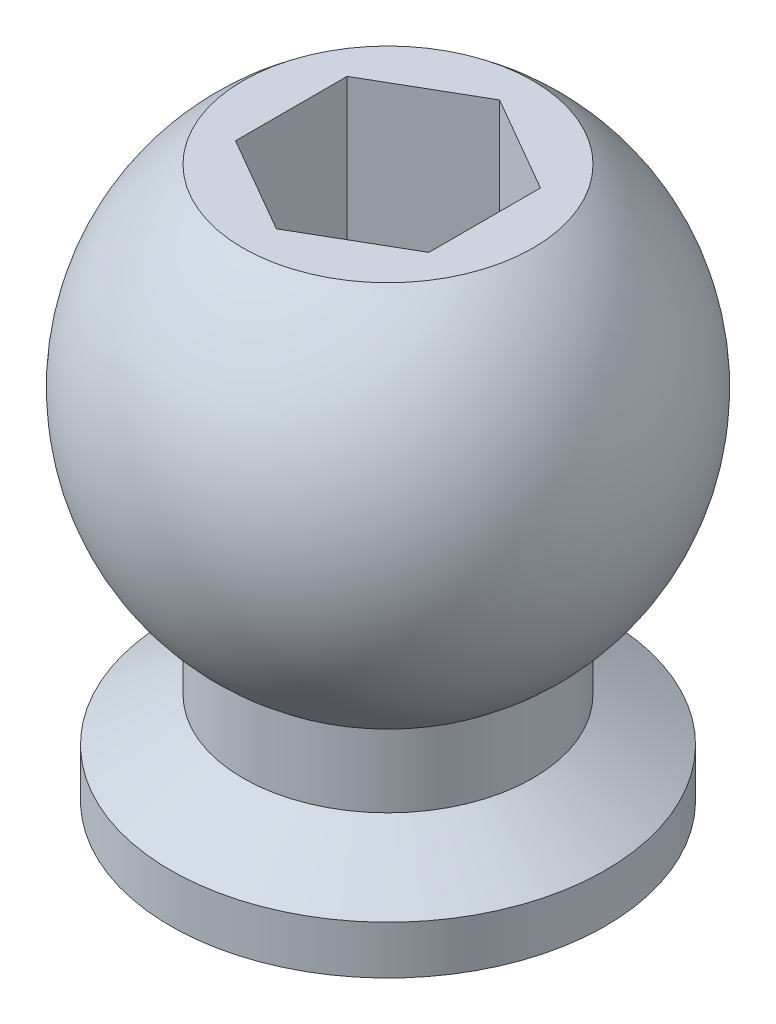
ISO-10303-21;
HEADER;
FILE_DESCRIPTION(('STEP AP214'),'2;1');
FILE_NAME('part.step','',(''),(''),'','','');
FILE_SCHEMA(('AUTOMOTIVE_DESIGN { 1 0 10303 214 1 1 1 1 }'));
ENDSEC;
DATA;
#1=APPLICATION_CONTEXT('core data for automotive mechanical design processes');
#2=APPLICATION_PROTOCOL_DEFINITION('international standard','automotive_design',2000,#1);
#3=PRODUCT_CONTEXT('',#1,'mechanical');
#4=PRODUCT('Part','Part','',(#3));
#5=PRODUCT_RELATED_PRODUCT_CATEGORY('part','',(#4));
#6=PRODUCT_DEFINITION_FORMATION('','',#4);
#7=PRODUCT_DEFINITION_CONTEXT('part definition',#1,'design');
#8=PRODUCT_DEFINITION('design','',#6,#7);
#9=PRODUCT_DEFINITION_SHAPE('','',#8);
#10=(LENGTH_UNIT() NAMED_UNIT(*) SI_UNIT(.MILLI.,.METRE.));
#11=(NAMED_UNIT(*) PLANE_ANGLE_UNIT() SI_UNIT($,.RADIAN.));
#12=(NAMED_UNIT(*) SI_UNIT($,.STERADIAN.) SOLID_ANGLE_UNIT());
#13=UNCERTAINTY_MEASURE_WITH_UNIT(LENGTH_MEASURE(1.E-05),#10,'distance_accuracy_value','');
#14=(GEOMETRIC_REPRESENTATION_CONTEXT(3) GLOBAL_UNCERTAINTY_ASSIGNED_CONTEXT((#13)) GLOBAL_UNIT_ASSIGNED_CONTEXT((#10,
#11,#12)) REPRESENTATION_CONTEXT('',''));
#15=CARTESIAN_POINT('',(0.,0.,0.));
#16=DIRECTION('',(0.,0.,1.));
#17=DIRECTION('',(1.,0.,0.));
#18=AXIS2_PLACEMENT_3D('',#15,#16,#17);
#19=CARTESIAN_POINT('',(0.,0.,0.));
#20=DIRECTION('',(0.,1.,0.));
#21=DIRECTION('',(0.,0.,1.));
#22=AXIS2_PLACEMENT_3D('',#19,#20,#21);
#23=PLANE('',#22);
#24=CARTESIAN_POINT('',(0.,0.,0.));
#25=DIRECTION('',(0.,-1.,0.));
#26=DIRECTION('',(0.,0.,-1.));
#27=AXIS2_PLACEMENT_3D('',#24,#25,#26);
#28=CIRCLE('',#27,0.8);
#29=CARTESIAN_POINT('',(0.,0.,-0.8));
#30=VERTEX_POINT('',#29);
#31=EDGE_CURVE('E213',#30,#30,#28,.T.);
#32=ORIENTED_EDGE('',*,*,#31,.F.);
#33=EDGE_LOOP('',(#32));
#34=FACE_BOUND('',#33,.T.);
#35=CARTESIAN_POINT('',(0.,0.,0.));
#36=DIRECTION('',(0.,-1.,0.));
#37=DIRECTION('',(0.,0.,-1.));
#38=AXIS2_PLACEMENT_3D('',#35,#36,#37);
#39=CIRCLE('',#38,2.25);
#40=CARTESIAN_POINT('',(0.,0.,-2.25));
#41=VERTEX_POINT('',#40);
#42=EDGE_CURVE('E139',#41,#41,#39,.T.);
#43=ORIENTED_EDGE('',*,*,#42,.T.);
#44=EDGE_LOOP('',(#43));
#45=FACE_BOUND('',#44,.T.);
#46=ADVANCED_FACE('F37',(#34,#45),#23,.F.);
#47=CARTESIAN_POINT('',(0.,5.7,0.));
#48=DIRECTION('',(0.,-1.,0.));
#49=DIRECTION('',(0.,0.,-1.));
#50=AXIS2_PLACEMENT_3D('',#47,#48,#49);
#51=PLANE('',#50);
#52=DIRECTION('',(0.86602540378443,0.,-0.500000000000015));
#53=VECTOR('',#52,1.);
#54=CARTESIAN_POINT('',(0.999999999999991,5.7,0.577350269189625));
#55=LINE('',#54,#53);
#56=CARTESIAN_POINT('',(0.,5.7,1.15470053837927));
#57=VERTEX_POINT('',#56);
#58=CARTESIAN_POINT('',(0.999999999999991,5.7,0.577350269189625));
#59=VERTEX_POINT('',#58);
#60=EDGE_CURVE('E126',#57,#59,#55,.T.);
#61=ORIENTED_EDGE('',*,*,#60,.F.);
#62=DIRECTION('',(0.86602540378443,0.,0.500000000000015));
#63=VECTOR('',#62,1.);
#64=CARTESIAN_POINT('',(0.,5.7,1.15470053837927));
#65=LINE('',#64,#63);
#66=CARTESIAN_POINT('',(-0.999999999999978,5.7,0.577350269189625));
#67=VERTEX_POINT('',#66);
#68=EDGE_CURVE('E52',#67,#57,#65,.T.);
#69=ORIENTED_EDGE('',*,*,#68,.F.);
#70=DIRECTION('',(0.,0.,1.));
#71=VECTOR('',#70,1.);
#72=CARTESIAN_POINT('',(-0.999999999999978,5.7,0.577350269189625));
#73=LINE('',#72,#71);
#74=CARTESIAN_POINT('',(-0.999999999999978,5.7,-0.577350269189621));
#75=VERTEX_POINT('',#74);
#76=EDGE_CURVE('E135',#75,#67,#73,.T.);
#77=ORIENTED_EDGE('',*,*,#76,.F.);
#78=DIRECTION('',(-0.86602540378443,0.,0.500000000000015));
#79=VECTOR('',#78,1.);
#80=CARTESIAN_POINT('',(-0.999999999999978,5.7,-0.577350269189621));
#81=LINE('',#80,#79);
#82=CARTESIAN_POINT('',(0.,5.7,-1.15470053837926));
#83=VERTEX_POINT('',#82);
#84=EDGE_CURVE('E133',#83,#75,#81,.T.);
#85=ORIENTED_EDGE('',*,*,#84,.F.);
#86=DIRECTION('',(-0.86602540378443,0.,-0.500000000000015));
#87=VECTOR('',#86,1.);
#88=CARTESIAN_POINT('',(0.,5.7,-1.15470053837926));
#89=LINE('',#88,#87);
#90=CARTESIAN_POINT('',(0.999999999999991,5.7,-0.577350269189621));
#91=VERTEX_POINT('',#90);
#92=EDGE_CURVE('E100',#91,#83,#89,.T.);
#93=ORIENTED_EDGE('',*,*,#92,.F.);
#94=DIRECTION('',(0.,0.,-1.));
#95=VECTOR('',#94,1.);
#96=CARTESIAN_POINT('',(0.999999999999991,5.7,-0.577350269189621));
#97=LINE('',#96,#95);
#98=EDGE_CURVE('E129',#59,#91,#97,.T.);
#99=ORIENTED_EDGE('',*,*,#98,.F.);
#100=EDGE_LOOP('',(#61,#69,#77,#85,#93,#99));
#101=FACE_BOUND('',#100,.T.);
#102=CARTESIAN_POINT('',(0.,5.7,0.));
#103=DIRECTION('',(0.,-1.,0.));
#104=DIRECTION('',(0.,0.,-1.));
#105=AXIS2_PLACEMENT_3D('',#102,#103,#104);
#106=CIRCLE('',#105,1.5);
#107=CARTESIAN_POINT('',(-1.5,5.7,0.));
#108=VERTEX_POINT('',#107);
#109=EDGE_CURVE('E11',#108,#108,#106,.T.);
#110=ORIENTED_EDGE('',*,*,#109,.F.);
#111=EDGE_LOOP('',(#110));
#112=FACE_BOUND('',#111,.T.);
#113=ADVANCED_FACE('F161',(#101,#112),#51,.F.);
#114=CARTESIAN_POINT('',(0.,3.7,0.));
#115=DIRECTION('',(0.,-1.,0.));
#116=DIRECTION('',(-1.,0.,0.));
#117=AXIS2_PLACEMENT_3D('',#114,#115,#116);
#118=SPHERICAL_SURFACE('',#117,2.5);
#119=CARTESIAN_POINT('',(0.,1.7,0.));
#120=DIRECTION('',(0.,-1.,0.));
#121=DIRECTION('',(0.,0.,-1.));
#122=AXIS2_PLACEMENT_3D('',#119,#120,#121);
#123=CIRCLE('',#122,1.5);
#124=CARTESIAN_POINT('',(-1.5,1.7,0.));
#125=VERTEX_POINT('',#124);
#126=EDGE_CURVE('E45',#125,#125,#123,.T.);
#127=CARTESIAN_POINT('',(-1.5,1.7,0.));
#128=CARTESIAN_POINT('',(-1.5386383877575,1.72897668414672,0.));
#129=CARTESIAN_POINT('',(-1.5764349304277,1.75907554612936,0.));
#130=CARTESIAN_POINT('',(-1.65022218904126,1.8214108940858,0.));
#131=CARTESIAN_POINT('',(-1.68621290498462,1.85364738005959,0.));
#132=CARTESIAN_POINT('',(-1.75626637359227,1.92015124431761,0.));
#133=CARTESIAN_POINT('',(-1.79032912625656,1.95441862260183,0.));
#134=CARTESIAN_POINT('',(-1.85641263057405,2.0248687968109,0.));
#135=CARTESIAN_POINT('',(-1.88843338222726,2.06105159273575,0.));
#136=CARTESIAN_POINT('',(-1.95032526836538,2.13521121103541,0.));
#137=CARTESIAN_POINT('',(-1.98019640285029,2.17318803341023,0.));
#138=CARTESIAN_POINT('',(-2.03768877346254,2.25080815107381,0.));
#139=CARTESIAN_POINT('',(-2.06531000958988,2.29045144636258,0.));
#140=CARTESIAN_POINT('',(-2.11820982609088,2.37127139738285,0.));
#141=CARTESIAN_POINT('',(-2.14348840646454,2.41244805311435,0.));
#142=CARTESIAN_POINT('',(-2.19161802896365,2.49619645368338,0.));
#143=CARTESIAN_POINT('',(-2.21446907108911,2.53876819852091,0.));
#144=CARTESIAN_POINT('',(-2.25766688391047,2.6251638239793,0.));
#145=CARTESIAN_POINT('',(-2.27801365460637,2.66898770460017,0.));
#146=CARTESIAN_POINT('',(-2.31613460121235,2.75774044297864,0.));
#147=CARTESIAN_POINT('',(-2.33390877712243,2.80266930073624,0.));
#148=CARTESIAN_POINT('',(-2.36682484928968,2.8934811244719,0.));
#149=CARTESIAN_POINT('',(-2.38196674554685,2.93936409044996,0.));
#150=CARTESIAN_POINT('',(-2.40956741265362,3.03193005780935,0.));
#151=CARTESIAN_POINT('',(-2.42202618350321,3.07861305919069,0.));
#152=CARTESIAN_POINT('',(-2.44421876383544,3.17262233807251,0.));
#153=CARTESIAN_POINT('',(-2.45395257331807,3.219948615573,0.));
#154=CARTESIAN_POINT('',(-2.47066254525011,3.31508552731488,0.));
#155=CARTESIAN_POINT('',(-2.47763870769951,3.36289616155627,0.));
#156=CARTESIAN_POINT('',(-2.48880995994487,3.4588412409559,0.));
#157=CARTESIAN_POINT('',(-2.49300504974084,3.50697568611415,0.));
#158=CARTESIAN_POINT('',(-2.49860006976841,3.60340675418159,0.));
#159=CARTESIAN_POINT('',(-2.5,3.6517033770908,0.));
#160=CARTESIAN_POINT('',(-2.5,3.74829662290921,0.));
#161=CARTESIAN_POINT('',(-2.49860006976841,3.79659324581841,0.));
#162=CARTESIAN_POINT('',(-2.49300504974084,3.89302431388586,0.));
#163=CARTESIAN_POINT('',(-2.48880995994487,3.9411587590441,0.));
#164=CARTESIAN_POINT('',(-2.47763870769951,4.03710383844373,0.));
#165=CARTESIAN_POINT('',(-2.47066254525011,4.08491447268513,0.));
#166=CARTESIAN_POINT('',(-2.45395257331807,4.180051384427,0.));
#167=CARTESIAN_POINT('',(-2.44421876383544,4.22737766192749,0.));
#168=CARTESIAN_POINT('',(-2.42202618350321,4.32138694080932,0.));
#169=CARTESIAN_POINT('',(-2.40956741265362,4.36806994219065,0.));
#170=CARTESIAN_POINT('',(-2.38196674554685,4.46063590955005,0.));
#171=CARTESIAN_POINT('',(-2.36682484928968,4.5065188755281,0.));
#172=CARTESIAN_POINT('',(-2.33390877712243,4.59733069926376,0.));
#173=CARTESIAN_POINT('',(-2.31613460121235,4.64225955702136,0.));
#174=CARTESIAN_POINT('',(-2.27801365460637,4.73101229539983,0.));
#175=CARTESIAN_POINT('',(-2.25766688391047,4.7748361760207,0.));
#176=CARTESIAN_POINT('',(-2.21446907108911,4.86123180147909,0.));
#177=CARTESIAN_POINT('',(-2.19161802896365,4.90380354631662,0.));
#178=CARTESIAN_POINT('',(-2.14348840646454,4.98755194688565,0.));
#179=CARTESIAN_POINT('',(-2.11820982609088,5.02872860261715,0.));
#180=CARTESIAN_POINT('',(-2.06531000958988,5.10954855363742,0.));
#181=CARTESIAN_POINT('',(-2.03768877346254,5.14919184892619,0.));
#182=CARTESIAN_POINT('',(-1.98019640285029,5.22681196658977,0.));
#183=CARTESIAN_POINT('',(-1.95032526836538,5.26478878896459,0.));
#184=CARTESIAN_POINT('',(-1.88843338222726,5.33894840726425,0.));
#185=CARTESIAN_POINT('',(-1.85641263057405,5.3751312031891,0.));
#186=CARTESIAN_POINT('',(-1.79032912625656,5.44558137739817,0.));
#187=CARTESIAN_POINT('',(-1.75626637359227,5.4798487556824,0.));
#188=CARTESIAN_POINT('',(-1.68621290498462,5.54635261994041,0.));
#189=CARTESIAN_POINT('',(-1.65022218904126,5.5785891059142,0.));
#190=CARTESIAN_POINT('',(-1.5764349304277,5.64092445387064,0.));
#191=CARTESIAN_POINT('',(-1.5386383877575,5.67102331585329,0.));
#192=CARTESIAN_POINT('',(-1.5,5.7,0.));
#193=B_SPLINE_CURVE_WITH_KNOTS('',3,(#127,#128,#129,#130,#131,#132,#133,#134,#135,#136,#137,
#138,#139,#140,#141,#142,#143,#144,#145,#146,#147,#148,#149,#150,#151,#152,#153,#154,#155,#156,
#157,#158,#159,#160,#161,#162,#163,#164,#165,#166,#167,#168,#169,#170,#171,#172,#173,#174,#175,
#176,#177,#178,#179,#180,#181,#182,#183,#184,#185,#186,#187,#188,#189,#190,#191,#192),
.UNSPECIFIED.,.F.,.F.,(4,2,2,2,2,2,2,2,2,2,2,2,2,2,2,2,2,2,2,2,2,2,2,2,2,2,2,2,2,2,2,2,4),(0.,
0.14486960076868,0.28973920153736,0.43460880230604,0.579478403074719,0.724348003843399,
0.869217604612079,1.01408720538076,1.15895680614944,1.30382640691812,1.4486960076868,
1.59356560845548,1.73843520922416,1.88330480999284,2.02817441076152,2.1730440115302,
2.31791361229888,2.46278321306756,2.60765281383624,2.75252241460492,2.89739201537359,
3.04226161614227,3.18713121691095,3.33200081767963,3.47687041844831,3.62174001921699,
3.76660961998567,3.91147922075435,4.05634882152303,4.20121842229171,4.34608802306039,
4.49095762382907,4.63582722459775),.UNSPECIFIED.);
#194=EDGE_CURVE('BSEAM158',#125,#108,#193,.T.);
#195=ORIENTED_EDGE('',*,*,#126,.F.);
#196=ORIENTED_EDGE('',*,*,#109,.T.);
#197=ORIENTED_EDGE('',*,*,#194,.T.);
#198=ORIENTED_EDGE('',*,*,#194,.F.);
#199=EDGE_LOOP('',(#195,#197,#196,#198));
#200=FACE_BOUND('',#199,.T.);
#201=ADVANCED_FACE('F158',(#200),#118,.T.);
#202=CARTESIAN_POINT('',(0.,0.,0.));
#203=DIRECTION('',(0.,-1.,0.));
#204=DIRECTION('',(0.,0.,-1.));
#205=AXIS2_PLACEMENT_3D('',#202,#203,#204);
#206=CYLINDRICAL_SURFACE('',#205,1.5);
#207=CARTESIAN_POINT('',(0.,0.95,0.));
#208=DIRECTION('',(0.,-1.,0.));
#209=DIRECTION('',(0.,0.,-1.));
#210=AXIS2_PLACEMENT_3D('',#207,#208,#209);
#211=CIRCLE('',#210,1.5);
#212=CARTESIAN_POINT('',(0.,0.95,-1.5));
#213=VERTEX_POINT('',#212);
#214=EDGE_CURVE('E150',#213,#213,#211,.T.);
#215=ORIENTED_EDGE('',*,*,#214,.F.);
#216=EDGE_LOOP('',(#215));
#217=FACE_BOUND('',#216,.T.);
#218=ORIENTED_EDGE('',*,*,#126,.T.);
#219=EDGE_LOOP('',(#218));
#220=FACE_BOUND('',#219,.T.);
#221=ADVANCED_FACE('F156',(#217,#220),#206,.T.);
#222=CARTESIAN_POINT('',(0.,0.95,0.));
#223=DIRECTION('',(0.,-1.,0.));
#224=DIRECTION('',(0.,0.,-1.));
#225=AXIS2_PLACEMENT_3D('',#222,#223,#224);
#226=CONICAL_SURFACE('',#225,1.5,1.03037682652431);
#227=CARTESIAN_POINT('',(0.,0.5,0.));
#228=DIRECTION('',(0.,-1.,0.));
#229=DIRECTION('',(0.,0.,-1.));
#230=AXIS2_PLACEMENT_3D('',#227,#228,#229);
#231=CIRCLE('',#230,2.25);
#232=CARTESIAN_POINT('',(0.,0.5,-2.25));
#233=VERTEX_POINT('',#232);
#234=EDGE_CURVE('E147',#233,#233,#231,.T.);
#235=ORIENTED_EDGE('',*,*,#234,.F.);
#236=EDGE_LOOP('',(#235));
#237=FACE_BOUND('',#236,.T.);
#238=ORIENTED_EDGE('',*,*,#214,.T.);
#239=EDGE_LOOP('',(#238));
#240=FACE_BOUND('',#239,.T.);
#241=ADVANCED_FACE('F175',(#237,#240),#226,.T.);
#242=CARTESIAN_POINT('',(0.,0.,0.));
#243=DIRECTION('',(0.,-1.,0.));
#244=DIRECTION('',(0.,0.,-1.));
#245=AXIS2_PLACEMENT_3D('',#242,#243,#244);
#246=CYLINDRICAL_SURFACE('',#245,2.25);
#247=ORIENTED_EDGE('',*,*,#42,.F.);
#248=EDGE_LOOP('',(#247));
#249=FACE_BOUND('',#248,.T.);
#250=ORIENTED_EDGE('',*,*,#234,.T.);
#251=EDGE_LOOP('',(#250));
#252=FACE_BOUND('',#251,.T.);
#253=ADVANCED_FACE('F179',(#249,#252),#246,.T.);
#254=CARTESIAN_POINT('',(0.,3.16,1.15470053837927));
#255=DIRECTION('',(-0.500000000000016,0.,0.86602540378443));
#256=DIRECTION('',(0.86602540378443,0.,0.500000000000016));
#257=AXIS2_PLACEMENT_3D('',#254,#255,#256);
#258=PLANE('',#257);
#259=ORIENTED_EDGE('',*,*,#68,.T.);
#260=DIRECTION('',(0.,1.,0.));
#261=VECTOR('',#260,1.);
#262=CARTESIAN_POINT('',(0.,3.16,1.15470053837927));
#263=LINE('',#262,#261);
#264=CARTESIAN_POINT('',(0.,3.16,1.15470053837927));
#265=VERTEX_POINT('',#264);
#266=EDGE_CURVE('E82',#265,#57,#263,.T.);
#267=ORIENTED_EDGE('',*,*,#266,.F.);
#268=DIRECTION('',(0.86602540378443,0.,0.500000000000015));
#269=VECTOR('',#268,1.);
#270=CARTESIAN_POINT('',(0.,3.16,1.15470053837927));
#271=LINE('',#270,#269);
#272=CARTESIAN_POINT('',(-0.999999999999978,3.16,0.577350269189625));
#273=VERTEX_POINT('',#272);
#274=EDGE_CURVE('E137',#273,#265,#271,.T.);
#275=ORIENTED_EDGE('',*,*,#274,.F.);
#276=DIRECTION('',(0.,1.,0.));
#277=VECTOR('',#276,1.);
#278=CARTESIAN_POINT('',(-0.999999999999978,3.16,0.577350269189625));
#279=LINE('',#278,#277);
#280=EDGE_CURVE('E60',#273,#67,#279,.T.);
#281=ORIENTED_EDGE('',*,*,#280,.T.);
#282=EDGE_LOOP('',(#259,#267,#275,#281));
#283=FACE_BOUND('',#282,.T.);
#284=ADVANCED_FACE('F183',(#283),#258,.F.);
#285=CARTESIAN_POINT('',(-0.999999999999978,3.16,0.577350269189625));
#286=DIRECTION('',(-1.,0.,0.));
#287=DIRECTION('',(0.,0.,1.));
#288=AXIS2_PLACEMENT_3D('',#285,#286,#287);
#289=PLANE('',#288);
#290=ORIENTED_EDGE('',*,*,#76,.T.);
#291=ORIENTED_EDGE('',*,*,#280,.F.);
#292=DIRECTION('',(0.,0.,1.));
#293=VECTOR('',#292,1.);
#294=CARTESIAN_POINT('',(-0.999999999999978,3.16,0.577350269189625));
#295=LINE('',#294,#293);
#296=CARTESIAN_POINT('',(-0.999999999999978,3.16,-0.577350269189621));
#297=VERTEX_POINT('',#296);
#298=EDGE_CURVE('E112',#297,#273,#295,.T.);
#299=ORIENTED_EDGE('',*,*,#298,.F.);
#300=DIRECTION('',(0.,1.,0.));
#301=VECTOR('',#300,1.);
#302=CARTESIAN_POINT('',(-0.999999999999978,3.16,-0.577350269189621));
#303=LINE('',#302,#301);
#304=EDGE_CURVE('E104',#297,#75,#303,.T.);
#305=ORIENTED_EDGE('',*,*,#304,.T.);
#306=EDGE_LOOP('',(#290,#291,#299,#305));
#307=FACE_BOUND('',#306,.T.);
#308=ADVANCED_FACE('F187',(#307),#289,.F.);
#309=CARTESIAN_POINT('',(-0.999999999999978,3.16,-0.577350269189621));
#310=DIRECTION('',(-0.500000000000016,0.,-0.86602540378443));
#311=DIRECTION('',(-0.86602540378443,0.,0.500000000000016));
#312=AXIS2_PLACEMENT_3D('',#309,#310,#311);
#313=PLANE('',#312);
#314=ORIENTED_EDGE('',*,*,#84,.T.);
#315=ORIENTED_EDGE('',*,*,#304,.F.);
#316=DIRECTION('',(-0.86602540378443,0.,0.500000000000015));
#317=VECTOR('',#316,1.);
#318=CARTESIAN_POINT('',(-0.999999999999978,3.16,-0.577350269189621));
#319=LINE('',#318,#317);
#320=CARTESIAN_POINT('',(0.,3.16,-1.15470053837926));
#321=VERTEX_POINT('',#320);
#322=EDGE_CURVE('E108',#321,#297,#319,.T.);
#323=ORIENTED_EDGE('',*,*,#322,.F.);
#324=DIRECTION('',(0.,1.,0.));
#325=VECTOR('',#324,1.);
#326=CARTESIAN_POINT('',(0.,3.16,-1.15470053837926));
#327=LINE('',#326,#325);
#328=EDGE_CURVE('E93',#321,#83,#327,.T.);
#329=ORIENTED_EDGE('',*,*,#328,.T.);
#330=EDGE_LOOP('',(#314,#315,#323,#329));
#331=FACE_BOUND('',#330,.T.);
#332=ADVANCED_FACE('F109',(#331),#313,.F.);
#333=CARTESIAN_POINT('',(0.,3.16,-1.15470053837926));
#334=DIRECTION('',(0.500000000000016,0.,-0.86602540378443));
#335=DIRECTION('',(-0.86602540378443,0.,-0.500000000000016));
#336=AXIS2_PLACEMENT_3D('',#333,#334,#335);
#337=PLANE('',#336);
#338=ORIENTED_EDGE('',*,*,#92,.T.);
#339=ORIENTED_EDGE('',*,*,#328,.F.);
#340=DIRECTION('',(-0.86602540378443,0.,-0.500000000000015));
#341=VECTOR('',#340,1.);
#342=CARTESIAN_POINT('',(0.,3.16,-1.15470053837926));
#343=LINE('',#342,#341);
#344=CARTESIAN_POINT('',(0.999999999999991,3.16,-0.577350269189621));
#345=VERTEX_POINT('',#344);
#346=EDGE_CURVE('E97',#345,#321,#343,.T.);
#347=ORIENTED_EDGE('',*,*,#346,.F.);
#348=DIRECTION('',(0.,1.,0.));
#349=VECTOR('',#348,1.);
#350=CARTESIAN_POINT('',(0.999999999999991,3.16,-0.577350269189621));
#351=LINE('',#350,#349);
#352=EDGE_CURVE('E105',#345,#91,#351,.T.);
#353=ORIENTED_EDGE('',*,*,#352,.T.);
#354=EDGE_LOOP('',(#338,#339,#347,#353));
#355=FACE_BOUND('',#354,.T.);
#356=ADVANCED_FACE('F95',(#355),#337,.F.);
#357=CARTESIAN_POINT('',(0.999999999999991,3.16,-0.577350269189621));
#358=DIRECTION('',(1.,0.,0.));
#359=DIRECTION('',(0.,0.,-1.));
#360=AXIS2_PLACEMENT_3D('',#357,#358,#359);
#361=PLANE('',#360);
#362=ORIENTED_EDGE('',*,*,#98,.T.);
#363=ORIENTED_EDGE('',*,*,#352,.F.);
#364=DIRECTION('',(0.,0.,-1.));
#365=VECTOR('',#364,1.);
#366=CARTESIAN_POINT('',(0.999999999999991,3.16,-0.577350269189621));
#367=LINE('',#366,#365);
#368=CARTESIAN_POINT('',(0.999999999999991,3.16,0.577350269189625));
#369=VERTEX_POINT('',#368);
#370=EDGE_CURVE('E118',#369,#345,#367,.T.);
#371=ORIENTED_EDGE('',*,*,#370,.F.);
#372=DIRECTION('',(0.,1.,0.));
#373=VECTOR('',#372,1.);
#374=CARTESIAN_POINT('',(0.999999999999991,3.16,0.577350269189625));
#375=LINE('',#374,#373);
#376=EDGE_CURVE('E142',#369,#59,#375,.T.);
#377=ORIENTED_EDGE('',*,*,#376,.T.);
#378=EDGE_LOOP('',(#362,#363,#371,#377));
#379=FACE_BOUND('',#378,.T.);
#380=ADVANCED_FACE('F191',(#379),#361,.F.);
#381=CARTESIAN_POINT('',(0.999999999999991,3.16,0.577350269189625));
#382=DIRECTION('',(0.500000000000016,0.,0.86602540378443));
#383=DIRECTION('',(0.86602540378443,0.,-0.500000000000016));
#384=AXIS2_PLACEMENT_3D('',#381,#382,#383);
#385=PLANE('',#384);
#386=ORIENTED_EDGE('',*,*,#60,.T.);
#387=ORIENTED_EDGE('',*,*,#376,.F.);
#388=DIRECTION('',(0.86602540378443,0.,-0.500000000000015));
#389=VECTOR('',#388,1.);
#390=CARTESIAN_POINT('',(0.999999999999991,3.16,0.577350269189625));
#391=LINE('',#390,#389);
#392=EDGE_CURVE('E120',#265,#369,#391,.T.);
#393=ORIENTED_EDGE('',*,*,#392,.F.);
#394=ORIENTED_EDGE('',*,*,#266,.T.);
#395=EDGE_LOOP('',(#386,#387,#393,#394));
#396=FACE_BOUND('',#395,.T.);
#397=ADVANCED_FACE('F188',(#396),#385,.F.);
#398=CARTESIAN_POINT('',(0.,3.16,0.));
#399=DIRECTION('',(0.,-1.,0.));
#400=DIRECTION('',(0.,0.,-1.));
#401=AXIS2_PLACEMENT_3D('',#398,#399,#400);
#402=PLANE('',#401);
#403=CARTESIAN_POINT('',(0.,3.16,0.));
#404=DIRECTION('',(0.,-1.,0.));
#405=DIRECTION('',(0.,0.,-1.));
#406=AXIS2_PLACEMENT_3D('',#403,#404,#405);
#407=CIRCLE('',#406,0.799999999999999);
#408=CARTESIAN_POINT('',(0.,3.16,-0.799999999999999));
#409=VERTEX_POINT('',#408);
#410=EDGE_CURVE('E40',#409,#409,#407,.T.);
#411=ORIENTED_EDGE('',*,*,#410,.T.);
#412=EDGE_LOOP('',(#411));
#413=FACE_BOUND('',#412,.T.);
#414=ORIENTED_EDGE('',*,*,#274,.T.);
#415=ORIENTED_EDGE('',*,*,#392,.T.);
#416=ORIENTED_EDGE('',*,*,#370,.T.);
#417=ORIENTED_EDGE('',*,*,#346,.T.);
#418=ORIENTED_EDGE('',*,*,#322,.T.);
#419=ORIENTED_EDGE('',*,*,#298,.T.);
#420=EDGE_LOOP('',(#414,#415,#416,#417,#418,#419));
#421=FACE_BOUND('',#420,.T.);
#422=ADVANCED_FACE('F115',(#413,#421),#402,.F.);
#423=CARTESIAN_POINT('',(0.,0.,0.));
#424=DIRECTION('',(0.,-1.,0.));
#425=DIRECTION('',(0.,0.,-1.));
#426=AXIS2_PLACEMENT_3D('',#423,#424,#425);
#427=CYLINDRICAL_SURFACE('',#426,0.799999999999999);
#428=ORIENTED_EDGE('',*,*,#31,.T.);
#429=EDGE_LOOP('',(#428));
#430=FACE_BOUND('',#429,.T.);
#431=ORIENTED_EDGE('',*,*,#410,.F.);
#432=EDGE_LOOP('',(#431));
#433=FACE_BOUND('',#432,.T.);
#434=ADVANCED_FACE('F204',(#430,#433),#427,.F.);
#435=CLOSED_SHELL('',(#46,#113,#201,#221,#241,#253,#284,#308,#332,#356,#380,#397,#422,#434));
#436=MANIFOLD_SOLID_BREP('B2',#435);
#437=ADVANCED_BREP_SHAPE_REPRESENTATION('',(#18,#436),#14);
#438=SHAPE_DEFINITION_REPRESENTATION(#9,#437);
ENDSEC;
END-ISO-10303-21;
